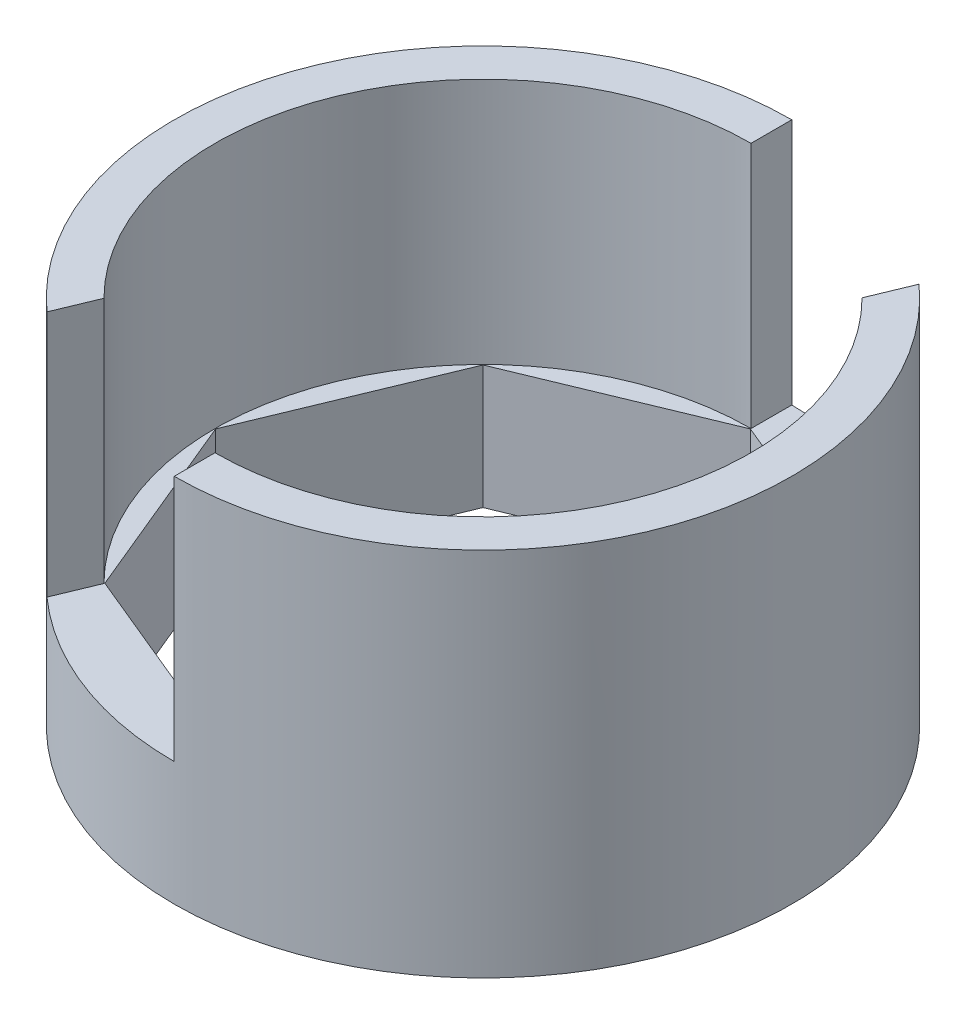
ISO-10303-21;
HEADER;
FILE_DESCRIPTION(('STEP AP214'),'2;1');
FILE_NAME('part.step','',(''),(''),'','','');
FILE_SCHEMA(('AUTOMOTIVE_DESIGN { 1 0 10303 214 1 1 1 1 }'));
ENDSEC;
DATA;
#1=APPLICATION_CONTEXT('core data for automotive mechanical design processes');
#2=APPLICATION_PROTOCOL_DEFINITION('international standard','automotive_design',2000,#1);
#3=PRODUCT_CONTEXT('',#1,'mechanical');
#4=PRODUCT('Part','Part','',(#3));
#5=PRODUCT_RELATED_PRODUCT_CATEGORY('part','',(#4));
#6=PRODUCT_DEFINITION_FORMATION('','',#4);
#7=PRODUCT_DEFINITION_CONTEXT('part definition',#1,'design');
#8=PRODUCT_DEFINITION('design','',#6,#7);
#9=PRODUCT_DEFINITION_SHAPE('','',#8);
#10=(LENGTH_UNIT() NAMED_UNIT(*) SI_UNIT(.MILLI.,.METRE.));
#11=(NAMED_UNIT(*) PLANE_ANGLE_UNIT() SI_UNIT($,.RADIAN.));
#12=(NAMED_UNIT(*) SI_UNIT($,.STERADIAN.) SOLID_ANGLE_UNIT());
#13=UNCERTAINTY_MEASURE_WITH_UNIT(LENGTH_MEASURE(1.E-05),#10,'distance_accuracy_value','');
#14=(GEOMETRIC_REPRESENTATION_CONTEXT(3) GLOBAL_UNCERTAINTY_ASSIGNED_CONTEXT((#13)) GLOBAL_UNIT_ASSIGNED_CONTEXT((#10,
#11,#12)) REPRESENTATION_CONTEXT('',''));
#15=CARTESIAN_POINT('',(0.,0.,0.));
#16=DIRECTION('',(0.,0.,1.));
#17=DIRECTION('',(1.,0.,0.));
#18=AXIS2_PLACEMENT_3D('',#15,#16,#17);
#19=CARTESIAN_POINT('',(0.,5.,0.));
#20=DIRECTION('',(0.,1.,0.));
#21=DIRECTION('',(0.,0.,1.));
#22=AXIS2_PLACEMENT_3D('',#19,#20,#21);
#23=PLANE('',#22);
#24=DIRECTION('',(-0.923879532511284,0.,0.382683432365097));
#25=VECTOR('',#24,1.);
#26=CARTESIAN_POINT('',(0.,5.,-10.8239220029239));
#27=LINE('',#26,#25);
#28=CARTESIAN_POINT('',(0.,5.,-10.8239220029239));
#29=VERTEX_POINT('',#28);
#30=CARTESIAN_POINT('',(-7.65366864730186,5.,-7.65366864730173));
#31=VERTEX_POINT('',#30);
#32=EDGE_CURVE('E239',#29,#31,#27,.T.);
#33=ORIENTED_EDGE('',*,*,#32,.F.);
#34=DIRECTION('',(-0.92387953251129,0.,-0.382683432365083));
#35=VECTOR('',#34,1.);
#36=CARTESIAN_POINT('',(7.65366864730174,5.,-7.65366864730186));
#37=LINE('',#36,#35);
#38=CARTESIAN_POINT('',(7.65366864730174,5.,-7.65366864730186));
#39=VERTEX_POINT('',#38);
#40=EDGE_CURVE('E237',#39,#29,#37,.T.);
#41=ORIENTED_EDGE('',*,*,#40,.F.);
#42=DIRECTION('',(-0.382683432365097,0.,-0.923879532511284));
#43=VECTOR('',#42,1.);
#44=CARTESIAN_POINT('',(10.8239220029239,5.,0.));
#45=LINE('',#44,#43);
#46=CARTESIAN_POINT('',(10.8239220029239,5.,0.));
#47=VERTEX_POINT('',#46);
#48=EDGE_CURVE('E253',#47,#39,#45,.T.);
#49=ORIENTED_EDGE('',*,*,#48,.F.);
#50=DIRECTION('',(0.382683432365082,0.,-0.92387953251129));
#51=VECTOR('',#50,1.);
#52=CARTESIAN_POINT('',(7.65366864730186,5.,7.65366864730174));
#53=LINE('',#52,#51);
#54=CARTESIAN_POINT('',(7.65366864730186,5.,7.65366864730174));
#55=VERTEX_POINT('',#54);
#56=EDGE_CURVE('E250',#55,#47,#53,.T.);
#57=ORIENTED_EDGE('',*,*,#56,.F.);
#58=DIRECTION('',(0.923879532511284,0.,-0.382683432365097));
#59=VECTOR('',#58,1.);
#60=CARTESIAN_POINT('',(0.,5.,10.8239220029239));
#61=LINE('',#60,#59);
#62=CARTESIAN_POINT('',(0.,5.,10.8239220029239));
#63=VERTEX_POINT('',#62);
#64=EDGE_CURVE('E248',#63,#55,#61,.T.);
#65=ORIENTED_EDGE('',*,*,#64,.F.);
#66=DIRECTION('',(0.92387953251129,0.,0.382683432365083));
#67=VECTOR('',#66,1.);
#68=CARTESIAN_POINT('',(-7.65366864730173,5.,7.65366864730186));
#69=LINE('',#68,#67);
#70=CARTESIAN_POINT('',(-7.65366864730173,5.,7.65366864730186));
#71=VERTEX_POINT('',#70);
#72=EDGE_CURVE('E246',#71,#63,#69,.T.);
#73=ORIENTED_EDGE('',*,*,#72,.F.);
#74=DIRECTION('',(0.382683432365097,0.,0.923879532511284));
#75=VECTOR('',#74,1.);
#76=CARTESIAN_POINT('',(-10.8239220029239,5.,0.));
#77=LINE('',#76,#75);
#78=CARTESIAN_POINT('',(-10.8239220029239,5.,0.));
#79=VERTEX_POINT('',#78);
#80=EDGE_CURVE('E244',#79,#71,#77,.T.);
#81=ORIENTED_EDGE('',*,*,#80,.F.);
#82=DIRECTION('',(-0.382683432365082,0.,0.92387953251129));
#83=VECTOR('',#82,1.);
#84=CARTESIAN_POINT('',(-7.65366864730186,5.,-7.65366864730173));
#85=LINE('',#84,#83);
#86=EDGE_CURVE('E242',#31,#79,#85,.T.);
#87=ORIENTED_EDGE('',*,*,#86,.F.);
#88=EDGE_LOOP('',(#33,#41,#49,#57,#65,#73,#81,#87));
#89=FACE_BOUND('',#88,.T.);
#90=DIRECTION('',(0.,0.,-1.));
#91=VECTOR('',#90,1.);
#92=CARTESIAN_POINT('',(0.,5.,0.));
#93=LINE('',#92,#91);
#94=CARTESIAN_POINT('',(0.,5.,12.5));
#95=VERTEX_POINT('',#94);
#96=CARTESIAN_POINT('',(0.,5.,10.85));
#97=VERTEX_POINT('',#96);
#98=EDGE_CURVE('E74',#95,#97,#93,.T.);
#99=ORIENTED_EDGE('',*,*,#98,.T.);
#100=CARTESIAN_POINT('',(0.,5.,0.));
#101=DIRECTION('',(0.,1.,0.));
#102=DIRECTION('',(0.,0.,1.));
#103=AXIS2_PLACEMENT_3D('',#100,#101,#102);
#104=CIRCLE('',#103,10.85);
#105=CARTESIAN_POINT('',(7.66445750792519,5.,-7.67975202133566));
#106=VERTEX_POINT('',#105);
#107=EDGE_CURVE('E79',#97,#106,#104,.T.);
#108=ORIENTED_EDGE('',*,*,#107,.T.);
#109=DIRECTION('',(0.38222294135357,0.,-0.924070139709657));
#110=VECTOR('',#109,1.);
#111=CARTESIAN_POINT('',(3.83222875396259,5.,1.58512398933217));
#112=LINE('',#111,#110);
#113=CARTESIAN_POINT('',(8.33940395896583,5.,-9.31151661165812));
#114=VERTEX_POINT('',#113);
#115=EDGE_CURVE('E196',#106,#114,#112,.T.);
#116=ORIENTED_EDGE('',*,*,#115,.T.);
#117=CARTESIAN_POINT('',(0.,5.,0.));
#118=DIRECTION('',(0.,1.,0.));
#119=DIRECTION('',(0.,0.,1.));
#120=AXIS2_PLACEMENT_3D('',#117,#118,#119);
#121=CIRCLE('',#120,12.5);
#122=CARTESIAN_POINT('',(0.,5.,-12.5));
#123=VERTEX_POINT('',#122);
#124=EDGE_CURVE('E68',#114,#123,#121,.T.);
#125=ORIENTED_EDGE('',*,*,#124,.T.);
#126=DIRECTION('',(0.,0.,-1.));
#127=VECTOR('',#126,1.);
#128=CARTESIAN_POINT('',(0.,5.,0.));
#129=LINE('',#128,#127);
#130=CARTESIAN_POINT('',(0.,5.,-10.85));
#131=VERTEX_POINT('',#130);
#132=EDGE_CURVE('E221',#131,#123,#129,.T.);
#133=ORIENTED_EDGE('',*,*,#132,.F.);
#134=CARTESIAN_POINT('',(0.,5.,0.));
#135=DIRECTION('',(0.,1.,0.));
#136=DIRECTION('',(0.,0.,1.));
#137=AXIS2_PLACEMENT_3D('',#134,#135,#136);
#138=CIRCLE('',#137,10.85);
#139=CARTESIAN_POINT('',(-7.66446828107499,5.,7.67974126962591));
#140=VERTEX_POINT('',#139);
#141=EDGE_CURVE('E180',#131,#140,#138,.T.);
#142=ORIENTED_EDGE('',*,*,#141,.T.);
#143=DIRECTION('',(-0.382683432365083,0.,0.92387953251129));
#144=VECTOR('',#143,1.);
#145=CARTESIAN_POINT('',(-3.82683432365091,5.,-1.58512667781104));
#146=LINE('',#145,#144);
#147=CARTESIAN_POINT('',(-8.34010986754271,5.,9.3108843509796));
#148=VERTEX_POINT('',#147);
#149=EDGE_CURVE('E212',#140,#148,#146,.T.);
#150=ORIENTED_EDGE('',*,*,#149,.T.);
#151=EDGE_CURVE('E12',#148,#95,#121,.T.);
#152=ORIENTED_EDGE('',*,*,#151,.T.);
#153=EDGE_LOOP('',(#99,#108,#116,#125,#133,#142,#150,#152));
#154=FACE_BOUND('',#153,.T.);
#155=ADVANCED_FACE('F59',(#89,#154),#23,.T.);
#156=CARTESIAN_POINT('',(0.,0.,0.));
#157=DIRECTION('',(0.,1.,0.));
#158=DIRECTION('',(0.,0.,1.));
#159=AXIS2_PLACEMENT_3D('',#156,#157,#158);
#160=PLANE('',#159);
#161=CARTESIAN_POINT('',(0.,0.,0.));
#162=DIRECTION('',(0.,1.,0.));
#163=DIRECTION('',(0.,0.,1.));
#164=AXIS2_PLACEMENT_3D('',#161,#162,#163);
#165=CIRCLE('',#164,12.5);
#166=CARTESIAN_POINT('',(0.,0.,12.5));
#167=VERTEX_POINT('',#166);
#168=EDGE_CURVE('E63',#167,#167,#165,.T.);
#169=ORIENTED_EDGE('',*,*,#168,.F.);
#170=EDGE_LOOP('',(#169));
#171=FACE_BOUND('',#170,.T.);
#172=DIRECTION('',(-0.92387953251129,0.,-0.382683432365083));
#173=VECTOR('',#172,1.);
#174=CARTESIAN_POINT('',(7.65366864730174,0.,-7.65366864730186));
#175=LINE('',#174,#173);
#176=CARTESIAN_POINT('',(7.65366864730174,0.,-7.65366864730186));
#177=VERTEX_POINT('',#176);
#178=CARTESIAN_POINT('',(0.,0.,-10.8239220029239));
#179=VERTEX_POINT('',#178);
#180=EDGE_CURVE('E236',#177,#179,#175,.T.);
#181=ORIENTED_EDGE('',*,*,#180,.T.);
#182=DIRECTION('',(-0.923879532511284,0.,0.382683432365097));
#183=VECTOR('',#182,1.);
#184=CARTESIAN_POINT('',(0.,0.,-10.8239220029239));
#185=LINE('',#184,#183);
#186=CARTESIAN_POINT('',(-7.65366864730186,0.,-7.65366864730173));
#187=VERTEX_POINT('',#186);
#188=EDGE_CURVE('E258',#179,#187,#185,.T.);
#189=ORIENTED_EDGE('',*,*,#188,.T.);
#190=DIRECTION('',(-0.382683432365082,0.,0.92387953251129));
#191=VECTOR('',#190,1.);
#192=CARTESIAN_POINT('',(-7.65366864730186,0.,-7.65366864730173));
#193=LINE('',#192,#191);
#194=CARTESIAN_POINT('',(-10.8239220029239,0.,0.));
#195=VERTEX_POINT('',#194);
#196=EDGE_CURVE('E261',#187,#195,#193,.T.);
#197=ORIENTED_EDGE('',*,*,#196,.T.);
#198=DIRECTION('',(0.382683432365097,0.,0.923879532511284));
#199=VECTOR('',#198,1.);
#200=CARTESIAN_POINT('',(-10.8239220029239,0.,0.));
#201=LINE('',#200,#199);
#202=CARTESIAN_POINT('',(-7.65366864730173,0.,7.65366864730186));
#203=VERTEX_POINT('',#202);
#204=EDGE_CURVE('E264',#195,#203,#201,.T.);
#205=ORIENTED_EDGE('',*,*,#204,.T.);
#206=DIRECTION('',(0.92387953251129,0.,0.382683432365083));
#207=VECTOR('',#206,1.);
#208=CARTESIAN_POINT('',(-7.65366864730173,0.,7.65366864730186));
#209=LINE('',#208,#207);
#210=CARTESIAN_POINT('',(0.,0.,10.8239220029239));
#211=VERTEX_POINT('',#210);
#212=EDGE_CURVE('E267',#203,#211,#209,.T.);
#213=ORIENTED_EDGE('',*,*,#212,.T.);
#214=DIRECTION('',(0.923879532511284,0.,-0.382683432365097));
#215=VECTOR('',#214,1.);
#216=CARTESIAN_POINT('',(0.,0.,10.8239220029239));
#217=LINE('',#216,#215);
#218=CARTESIAN_POINT('',(7.65366864730186,0.,7.65366864730174));
#219=VERTEX_POINT('',#218);
#220=EDGE_CURVE('E270',#211,#219,#217,.T.);
#221=ORIENTED_EDGE('',*,*,#220,.T.);
#222=DIRECTION('',(0.382683432365082,0.,-0.92387953251129));
#223=VECTOR('',#222,1.);
#224=CARTESIAN_POINT('',(7.65366864730186,0.,7.65366864730174));
#225=LINE('',#224,#223);
#226=CARTESIAN_POINT('',(10.8239220029239,0.,0.));
#227=VERTEX_POINT('',#226);
#228=EDGE_CURVE('E273',#219,#227,#225,.T.);
#229=ORIENTED_EDGE('',*,*,#228,.T.);
#230=DIRECTION('',(-0.382683432365097,0.,-0.923879532511284));
#231=VECTOR('',#230,1.);
#232=CARTESIAN_POINT('',(10.8239220029239,0.,0.));
#233=LINE('',#232,#231);
#234=EDGE_CURVE('E240',#227,#177,#233,.T.);
#235=ORIENTED_EDGE('',*,*,#234,.T.);
#236=EDGE_LOOP('',(#181,#189,#197,#205,#213,#221,#229,#235));
#237=FACE_BOUND('',#236,.T.);
#238=ADVANCED_FACE('F324',(#171,#237),#160,.F.);
#239=CARTESIAN_POINT('',(0.,5.,0.));
#240=DIRECTION('',(0.,-1.,0.));
#241=DIRECTION('',(0.,0.,-1.));
#242=AXIS2_PLACEMENT_3D('',#239,#240,#241);
#243=CYLINDRICAL_SURFACE('',#242,12.5);
#244=ORIENTED_EDGE('',*,*,#151,.F.);
#245=DIRECTION('',(0.,-1.,0.));
#246=VECTOR('',#245,1.);
#247=CARTESIAN_POINT('',(-8.34010986754271,15.,9.3108843509796));
#248=LINE('',#247,#246);
#249=CARTESIAN_POINT('',(-8.34010986754271,15.,9.3108843509796));
#250=VERTEX_POINT('',#249);
#251=EDGE_CURVE('E227',#250,#148,#248,.T.);
#252=ORIENTED_EDGE('',*,*,#251,.F.);
#253=CARTESIAN_POINT('',(0.,15.,0.));
#254=DIRECTION('',(0.,1.,0.));
#255=DIRECTION('',(0.,0.,1.));
#256=AXIS2_PLACEMENT_3D('',#253,#254,#255);
#257=CIRCLE('',#256,12.5);
#258=CARTESIAN_POINT('',(0.,15.,-12.5));
#259=VERTEX_POINT('',#258);
#260=EDGE_CURVE('E214',#259,#250,#257,.T.);
#261=ORIENTED_EDGE('',*,*,#260,.F.);
#262=DIRECTION('',(0.,-1.,0.));
#263=VECTOR('',#262,1.);
#264=CARTESIAN_POINT('',(0.,15.,-12.5));
#265=LINE('',#264,#263);
#266=EDGE_CURVE('E230',#259,#123,#265,.T.);
#267=ORIENTED_EDGE('',*,*,#266,.T.);
#268=ORIENTED_EDGE('',*,*,#124,.F.);
#269=DIRECTION('',(0.,-1.,0.));
#270=VECTOR('',#269,1.);
#271=CARTESIAN_POINT('',(8.33940395896583,15.,-9.31151661165812));
#272=LINE('',#271,#270);
#273=CARTESIAN_POINT('',(8.33940395896583,15.,-9.31151661165812));
#274=VERTEX_POINT('',#273);
#275=EDGE_CURVE('E181',#274,#114,#272,.T.);
#276=ORIENTED_EDGE('',*,*,#275,.F.);
#277=CARTESIAN_POINT('',(0.,15.,0.));
#278=DIRECTION('',(0.,1.,0.));
#279=DIRECTION('',(0.,0.,1.));
#280=AXIS2_PLACEMENT_3D('',#277,#278,#279);
#281=CIRCLE('',#280,12.5);
#282=CARTESIAN_POINT('',(0.,15.,12.5));
#283=VERTEX_POINT('',#282);
#284=EDGE_CURVE('E184',#283,#274,#281,.T.);
#285=ORIENTED_EDGE('',*,*,#284,.F.);
#286=DIRECTION('',(0.,-1.,0.));
#287=VECTOR('',#286,1.);
#288=CARTESIAN_POINT('',(0.,15.,12.5));
#289=LINE('',#288,#287);
#290=EDGE_CURVE('E172',#283,#95,#289,.T.);
#291=ORIENTED_EDGE('',*,*,#290,.T.);
#292=EDGE_LOOP('',(#244,#252,#261,#267,#268,#276,#285,#291));
#293=FACE_BOUND('',#292,.T.);
#294=ORIENTED_EDGE('',*,*,#168,.T.);
#295=EDGE_LOOP('',(#294));
#296=FACE_BOUND('',#295,.T.);
#297=ADVANCED_FACE('F61',(#293,#296),#243,.T.);
#298=CARTESIAN_POINT('',(7.65366864730174,5.,-7.65366864730186));
#299=DIRECTION('',(-0.382683432365083,0.,0.92387953251129));
#300=DIRECTION('',(0.92387953251129,0.,0.382683432365083));
#301=AXIS2_PLACEMENT_3D('',#298,#299,#300);
#302=PLANE('',#301);
#303=ORIENTED_EDGE('',*,*,#180,.F.);
#304=DIRECTION('',(0.,-1.,0.));
#305=VECTOR('',#304,1.);
#306=CARTESIAN_POINT('',(7.65366864730174,5.,-7.65366864730186));
#307=LINE('',#306,#305);
#308=EDGE_CURVE('E255',#39,#177,#307,.T.);
#309=ORIENTED_EDGE('',*,*,#308,.F.);
#310=ORIENTED_EDGE('',*,*,#40,.T.);
#311=DIRECTION('',(0.,-1.,0.));
#312=VECTOR('',#311,1.);
#313=CARTESIAN_POINT('',(0.,5.,-10.8239220029239));
#314=LINE('',#313,#312);
#315=EDGE_CURVE('E292',#29,#179,#314,.T.);
#316=ORIENTED_EDGE('',*,*,#315,.T.);
#317=EDGE_LOOP('',(#303,#309,#310,#316));
#318=FACE_BOUND('',#317,.T.);
#319=ADVANCED_FACE('F333',(#318),#302,.T.);
#320=CARTESIAN_POINT('',(0.,5.,-10.8239220029239));
#321=DIRECTION('',(0.382683432365097,0.,0.923879532511284));
#322=DIRECTION('',(0.923879532511284,0.,-0.382683432365097));
#323=AXIS2_PLACEMENT_3D('',#320,#321,#322);
#324=PLANE('',#323);
#325=ORIENTED_EDGE('',*,*,#188,.F.);
#326=ORIENTED_EDGE('',*,*,#315,.F.);
#327=ORIENTED_EDGE('',*,*,#32,.T.);
#328=DIRECTION('',(0.,-1.,0.));
#329=VECTOR('',#328,1.);
#330=CARTESIAN_POINT('',(-7.65366864730186,5.,-7.65366864730173));
#331=LINE('',#330,#329);
#332=EDGE_CURVE('E290',#31,#187,#331,.T.);
#333=ORIENTED_EDGE('',*,*,#332,.T.);
#334=EDGE_LOOP('',(#325,#326,#327,#333));
#335=FACE_BOUND('',#334,.T.);
#336=ADVANCED_FACE('F336',(#335),#324,.T.);
#337=CARTESIAN_POINT('',(-7.65366864730186,5.,-7.65366864730173));
#338=DIRECTION('',(0.92387953251129,0.,0.382683432365082));
#339=DIRECTION('',(0.382683432365082,0.,-0.92387953251129));
#340=AXIS2_PLACEMENT_3D('',#337,#338,#339);
#341=PLANE('',#340);
#342=ORIENTED_EDGE('',*,*,#196,.F.);
#343=ORIENTED_EDGE('',*,*,#332,.F.);
#344=ORIENTED_EDGE('',*,*,#86,.T.);
#345=DIRECTION('',(0.,-1.,0.));
#346=VECTOR('',#345,1.);
#347=CARTESIAN_POINT('',(-10.8239220029239,5.,0.));
#348=LINE('',#347,#346);
#349=EDGE_CURVE('E288',#79,#195,#348,.T.);
#350=ORIENTED_EDGE('',*,*,#349,.T.);
#351=EDGE_LOOP('',(#342,#343,#344,#350));
#352=FACE_BOUND('',#351,.T.);
#353=ADVANCED_FACE('F339',(#352),#341,.T.);
#354=CARTESIAN_POINT('',(-10.8239220029239,5.,0.));
#355=DIRECTION('',(0.923879532511284,0.,-0.382683432365097));
#356=DIRECTION('',(-0.382683432365097,0.,-0.923879532511284));
#357=AXIS2_PLACEMENT_3D('',#354,#355,#356);
#358=PLANE('',#357);
#359=ORIENTED_EDGE('',*,*,#204,.F.);
#360=ORIENTED_EDGE('',*,*,#349,.F.);
#361=ORIENTED_EDGE('',*,*,#80,.T.);
#362=DIRECTION('',(0.,-1.,0.));
#363=VECTOR('',#362,1.);
#364=CARTESIAN_POINT('',(-7.65366864730173,5.,7.65366864730186));
#365=LINE('',#364,#363);
#366=EDGE_CURVE('E286',#71,#203,#365,.T.);
#367=ORIENTED_EDGE('',*,*,#366,.T.);
#368=EDGE_LOOP('',(#359,#360,#361,#367));
#369=FACE_BOUND('',#368,.T.);
#370=ADVANCED_FACE('F343',(#369),#358,.T.);
#371=CARTESIAN_POINT('',(-7.65366864730173,5.,7.65366864730186));
#372=DIRECTION('',(0.382683432365082,0.,-0.92387953251129));
#373=DIRECTION('',(-0.92387953251129,0.,-0.382683432365082));
#374=AXIS2_PLACEMENT_3D('',#371,#372,#373);
#375=PLANE('',#374);
#376=ORIENTED_EDGE('',*,*,#212,.F.);
#377=ORIENTED_EDGE('',*,*,#366,.F.);
#378=ORIENTED_EDGE('',*,*,#72,.T.);
#379=DIRECTION('',(0.,-1.,0.));
#380=VECTOR('',#379,1.);
#381=CARTESIAN_POINT('',(0.,5.,10.8239220029239));
#382=LINE('',#381,#380);
#383=EDGE_CURVE('E284',#63,#211,#382,.T.);
#384=ORIENTED_EDGE('',*,*,#383,.T.);
#385=EDGE_LOOP('',(#376,#377,#378,#384));
#386=FACE_BOUND('',#385,.T.);
#387=ADVANCED_FACE('F347',(#386),#375,.T.);
#388=CARTESIAN_POINT('',(0.,5.,10.8239220029239));
#389=DIRECTION('',(-0.382683432365097,0.,-0.923879532511284));
#390=DIRECTION('',(-0.923879532511284,0.,0.382683432365097));
#391=AXIS2_PLACEMENT_3D('',#388,#389,#390);
#392=PLANE('',#391);
#393=ORIENTED_EDGE('',*,*,#220,.F.);
#394=ORIENTED_EDGE('',*,*,#383,.F.);
#395=ORIENTED_EDGE('',*,*,#64,.T.);
#396=DIRECTION('',(0.,-1.,0.));
#397=VECTOR('',#396,1.);
#398=CARTESIAN_POINT('',(7.65366864730186,5.,7.65366864730174));
#399=LINE('',#398,#397);
#400=EDGE_CURVE('E282',#55,#219,#399,.T.);
#401=ORIENTED_EDGE('',*,*,#400,.T.);
#402=EDGE_LOOP('',(#393,#394,#395,#401));
#403=FACE_BOUND('',#402,.T.);
#404=ADVANCED_FACE('F351',(#403),#392,.T.);
#405=CARTESIAN_POINT('',(7.65366864730186,5.,7.65366864730174));
#406=DIRECTION('',(-0.92387953251129,0.,-0.382683432365082));
#407=DIRECTION('',(-0.382683432365082,0.,0.92387953251129));
#408=AXIS2_PLACEMENT_3D('',#405,#406,#407);
#409=PLANE('',#408);
#410=ORIENTED_EDGE('',*,*,#228,.F.);
#411=ORIENTED_EDGE('',*,*,#400,.F.);
#412=ORIENTED_EDGE('',*,*,#56,.T.);
#413=DIRECTION('',(0.,-1.,0.));
#414=VECTOR('',#413,1.);
#415=CARTESIAN_POINT('',(10.8239220029239,5.,0.));
#416=LINE('',#415,#414);
#417=EDGE_CURVE('E280',#47,#227,#416,.T.);
#418=ORIENTED_EDGE('',*,*,#417,.T.);
#419=EDGE_LOOP('',(#410,#411,#412,#418));
#420=FACE_BOUND('',#419,.T.);
#421=ADVANCED_FACE('F355',(#420),#409,.T.);
#422=CARTESIAN_POINT('',(10.8239220029239,5.,0.));
#423=DIRECTION('',(-0.923879532511284,0.,0.382683432365097));
#424=DIRECTION('',(0.382683432365097,0.,0.923879532511284));
#425=AXIS2_PLACEMENT_3D('',#422,#423,#424);
#426=PLANE('',#425);
#427=ORIENTED_EDGE('',*,*,#234,.F.);
#428=ORIENTED_EDGE('',*,*,#417,.F.);
#429=ORIENTED_EDGE('',*,*,#48,.T.);
#430=ORIENTED_EDGE('',*,*,#308,.T.);
#431=EDGE_LOOP('',(#427,#428,#429,#430));
#432=FACE_BOUND('',#431,.T.);
#433=ADVANCED_FACE('F359',(#432),#426,.T.);
#434=CARTESIAN_POINT('',(0.,15.,0.));
#435=DIRECTION('',(0.,-1.,0.));
#436=DIRECTION('',(0.,0.,-1.));
#437=AXIS2_PLACEMENT_3D('',#434,#435,#436);
#438=CYLINDRICAL_SURFACE('',#437,10.85);
#439=ORIENTED_EDGE('',*,*,#141,.F.);
#440=DIRECTION('',(0.,-1.,0.));
#441=VECTOR('',#440,1.);
#442=CARTESIAN_POINT('',(0.,15.,-10.85));
#443=LINE('',#442,#441);
#444=CARTESIAN_POINT('',(0.,15.,-10.85));
#445=VERTEX_POINT('',#444);
#446=EDGE_CURVE('E233',#445,#131,#443,.T.);
#447=ORIENTED_EDGE('',*,*,#446,.F.);
#448=CARTESIAN_POINT('',(0.,15.,0.));
#449=DIRECTION('',(0.,1.,0.));
#450=DIRECTION('',(0.,0.,1.));
#451=AXIS2_PLACEMENT_3D('',#448,#449,#450);
#452=CIRCLE('',#451,10.85);
#453=CARTESIAN_POINT('',(-7.66446828107499,15.,7.67974126962591));
#454=VERTEX_POINT('',#453);
#455=EDGE_CURVE('E208',#445,#454,#452,.T.);
#456=ORIENTED_EDGE('',*,*,#455,.T.);
#457=DIRECTION('',(0.,-1.,0.));
#458=VECTOR('',#457,1.);
#459=CARTESIAN_POINT('',(-7.66446828107499,15.,7.67974126962591));
#460=LINE('',#459,#458);
#461=EDGE_CURVE('E219',#454,#140,#460,.T.);
#462=ORIENTED_EDGE('',*,*,#461,.T.);
#463=EDGE_LOOP('',(#439,#447,#456,#462));
#464=FACE_BOUND('',#463,.T.);
#465=ADVANCED_FACE('F311',(#464),#438,.F.);
#466=CARTESIAN_POINT('',(0.,15.,0.));
#467=DIRECTION('',(-1.,0.,0.));
#468=DIRECTION('',(0.,0.,1.));
#469=AXIS2_PLACEMENT_3D('',#466,#467,#468);
#470=PLANE('',#469);
#471=ORIENTED_EDGE('',*,*,#132,.T.);
#472=ORIENTED_EDGE('',*,*,#266,.F.);
#473=DIRECTION('',(0.,0.,-1.));
#474=VECTOR('',#473,1.);
#475=CARTESIAN_POINT('',(0.,15.,0.));
#476=LINE('',#475,#474);
#477=EDGE_CURVE('E211',#445,#259,#476,.T.);
#478=ORIENTED_EDGE('',*,*,#477,.F.);
#479=ORIENTED_EDGE('',*,*,#446,.T.);
#480=EDGE_LOOP('',(#471,#472,#478,#479));
#481=FACE_BOUND('',#480,.T.);
#482=ADVANCED_FACE('F301',(#481),#470,.F.);
#483=CARTESIAN_POINT('',(-3.82683432365091,15.,-1.58512667781104));
#484=DIRECTION('',(0.92387953251129,0.,0.382683432365083));
#485=DIRECTION('',(0.382683432365083,0.,-0.92387953251129));
#486=AXIS2_PLACEMENT_3D('',#483,#484,#485);
#487=PLANE('',#486);
#488=ORIENTED_EDGE('',*,*,#149,.F.);
#489=ORIENTED_EDGE('',*,*,#461,.F.);
#490=DIRECTION('',(-0.382683432365083,0.,0.92387953251129));
#491=VECTOR('',#490,1.);
#492=CARTESIAN_POINT('',(-3.82683432365091,15.,-1.58512667781104));
#493=LINE('',#492,#491);
#494=EDGE_CURVE('E216',#454,#250,#493,.T.);
#495=ORIENTED_EDGE('',*,*,#494,.T.);
#496=ORIENTED_EDGE('',*,*,#251,.T.);
#497=EDGE_LOOP('',(#488,#489,#495,#496));
#498=FACE_BOUND('',#497,.T.);
#499=ADVANCED_FACE('F314',(#498),#487,.T.);
#500=CARTESIAN_POINT('',(0.,15.,0.));
#501=DIRECTION('',(0.,1.,0.));
#502=DIRECTION('',(0.,0.,1.));
#503=AXIS2_PLACEMENT_3D('',#500,#501,#502);
#504=PLANE('',#503);
#505=ORIENTED_EDGE('',*,*,#455,.F.);
#506=ORIENTED_EDGE('',*,*,#477,.T.);
#507=ORIENTED_EDGE('',*,*,#260,.T.);
#508=ORIENTED_EDGE('',*,*,#494,.F.);
#509=EDGE_LOOP('',(#505,#506,#507,#508));
#510=FACE_BOUND('',#509,.T.);
#511=ADVANCED_FACE('F309',(#510),#504,.T.);
#512=CARTESIAN_POINT('',(0.,15.,0.));
#513=DIRECTION('',(-1.,0.,0.));
#514=DIRECTION('',(0.,0.,1.));
#515=AXIS2_PLACEMENT_3D('',#512,#513,#514);
#516=PLANE('',#515);
#517=ORIENTED_EDGE('',*,*,#98,.F.);
#518=ORIENTED_EDGE('',*,*,#290,.F.);
#519=DIRECTION('',(0.,0.,-1.));
#520=VECTOR('',#519,1.);
#521=CARTESIAN_POINT('',(0.,15.,0.));
#522=LINE('',#521,#520);
#523=CARTESIAN_POINT('',(0.,15.,10.85));
#524=VERTEX_POINT('',#523);
#525=EDGE_CURVE('E176',#283,#524,#522,.T.);
#526=ORIENTED_EDGE('',*,*,#525,.T.);
#527=DIRECTION('',(0.,-1.,0.));
#528=VECTOR('',#527,1.);
#529=CARTESIAN_POINT('',(0.,15.,10.85));
#530=LINE('',#529,#528);
#531=EDGE_CURVE('E201',#524,#97,#530,.T.);
#532=ORIENTED_EDGE('',*,*,#531,.T.);
#533=EDGE_LOOP('',(#517,#518,#526,#532));
#534=FACE_BOUND('',#533,.T.);
#535=ADVANCED_FACE('F174',(#534),#516,.T.);
#536=CARTESIAN_POINT('',(3.83222875396259,15.,1.58512398933217));
#537=DIRECTION('',(-0.924070139709657,0.,-0.38222294135357));
#538=DIRECTION('',(-0.38222294135357,0.,0.924070139709657));
#539=AXIS2_PLACEMENT_3D('',#536,#537,#538);
#540=PLANE('',#539);
#541=ORIENTED_EDGE('',*,*,#115,.F.);
#542=DIRECTION('',(0.,-1.,0.));
#543=VECTOR('',#542,1.);
#544=CARTESIAN_POINT('',(7.6644575079252,15.,-7.67975202133566));
#545=LINE('',#544,#543);
#546=CARTESIAN_POINT('',(7.6644575079252,15.,-7.67975202133566));
#547=VERTEX_POINT('',#546);
#548=EDGE_CURVE('E205',#547,#106,#545,.T.);
#549=ORIENTED_EDGE('',*,*,#548,.F.);
#550=DIRECTION('',(0.38222294135357,0.,-0.924070139709657));
#551=VECTOR('',#550,1.);
#552=CARTESIAN_POINT('',(3.83222875396259,15.,1.58512398933217));
#553=LINE('',#552,#551);
#554=EDGE_CURVE('E190',#547,#274,#553,.T.);
#555=ORIENTED_EDGE('',*,*,#554,.T.);
#556=ORIENTED_EDGE('',*,*,#275,.T.);
#557=EDGE_LOOP('',(#541,#549,#555,#556));
#558=FACE_BOUND('',#557,.T.);
#559=ADVANCED_FACE('F393',(#558),#540,.T.);
#560=CARTESIAN_POINT('',(0.,15.,0.));
#561=DIRECTION('',(0.,-1.,0.));
#562=DIRECTION('',(0.,0.,-1.));
#563=AXIS2_PLACEMENT_3D('',#560,#561,#562);
#564=CYLINDRICAL_SURFACE('',#563,10.85);
#565=ORIENTED_EDGE('',*,*,#107,.F.);
#566=ORIENTED_EDGE('',*,*,#531,.F.);
#567=CARTESIAN_POINT('',(0.,15.,0.));
#568=DIRECTION('',(0.,1.,0.));
#569=DIRECTION('',(0.,0.,1.));
#570=AXIS2_PLACEMENT_3D('',#567,#568,#569);
#571=CIRCLE('',#570,10.85);
#572=EDGE_CURVE('E194',#524,#547,#571,.T.);
#573=ORIENTED_EDGE('',*,*,#572,.T.);
#574=ORIENTED_EDGE('',*,*,#548,.T.);
#575=EDGE_LOOP('',(#565,#566,#573,#574));
#576=FACE_BOUND('',#575,.T.);
#577=ADVANCED_FACE('F402',(#576),#564,.F.);
#578=CARTESIAN_POINT('',(0.,15.,0.));
#579=DIRECTION('',(0.,1.,0.));
#580=DIRECTION('',(0.,0.,1.));
#581=AXIS2_PLACEMENT_3D('',#578,#579,#580);
#582=PLANE('',#581);
#583=ORIENTED_EDGE('',*,*,#525,.F.);
#584=ORIENTED_EDGE('',*,*,#284,.T.);
#585=ORIENTED_EDGE('',*,*,#554,.F.);
#586=ORIENTED_EDGE('',*,*,#572,.F.);
#587=EDGE_LOOP('',(#583,#584,#585,#586));
#588=FACE_BOUND('',#587,.T.);
#589=ADVANCED_FACE('F192',(#588),#582,.T.);
#590=CLOSED_SHELL('',(#155,#238,#297,#319,#336,#353,#370,#387,#404,#421,#433,#465,#482,#499,
#511,#535,#559,#577,#589));
#591=MANIFOLD_SOLID_BREP('B2',#590);
#592=ADVANCED_BREP_SHAPE_REPRESENTATION('',(#18,#591),#14);
#593=SHAPE_DEFINITION_REPRESENTATION(#9,#592);
ENDSEC;
END-ISO-10303-21;
